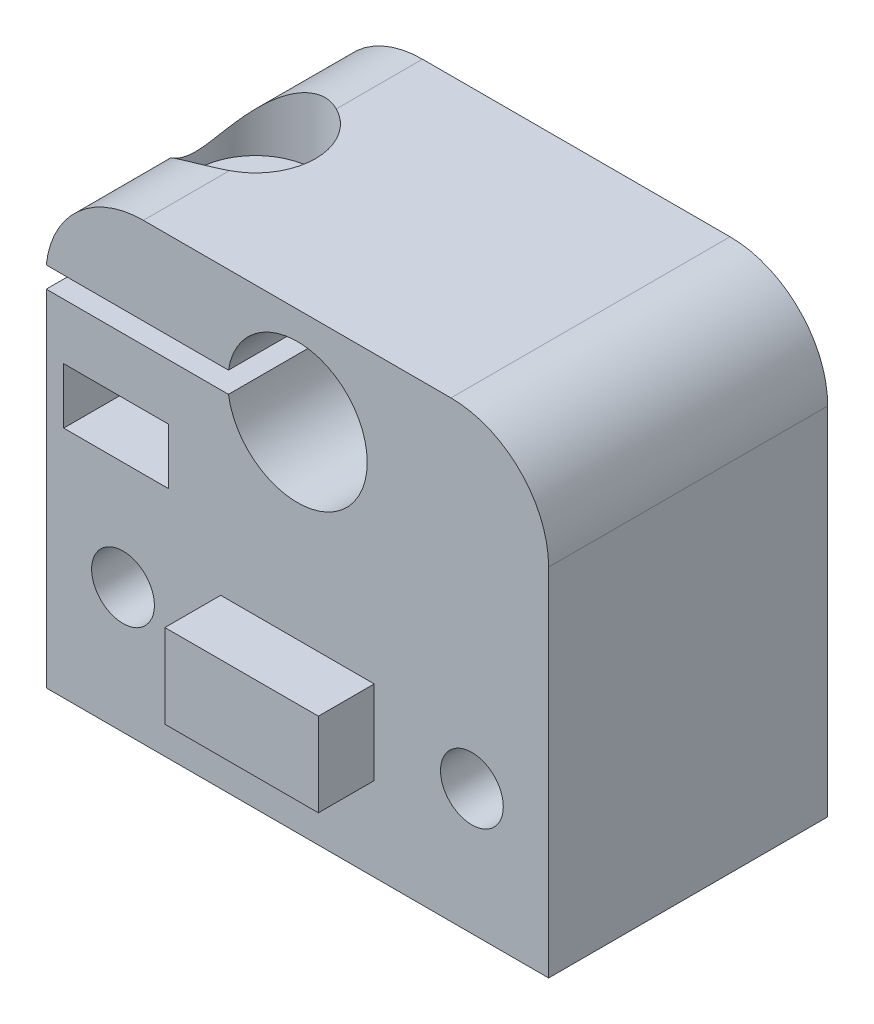
ISO-10303-21;
HEADER;
FILE_DESCRIPTION(('STEP AP214'),'2;1');
FILE_NAME('part.step','',(''),(''),'','','');
FILE_SCHEMA(('AUTOMOTIVE_DESIGN { 1 0 10303 214 1 1 1 1 }'));
ENDSEC;
DATA;
#1=APPLICATION_CONTEXT('core data for automotive mechanical design processes');
#2=APPLICATION_PROTOCOL_DEFINITION('international standard','automotive_design',2000,#1);
#3=PRODUCT_CONTEXT('',#1,'mechanical');
#4=PRODUCT('Part','Part','',(#3));
#5=PRODUCT_RELATED_PRODUCT_CATEGORY('part','',(#4));
#6=PRODUCT_DEFINITION_FORMATION('','',#4);
#7=PRODUCT_DEFINITION_CONTEXT('part definition',#1,'design');
#8=PRODUCT_DEFINITION('design','',#6,#7);
#9=PRODUCT_DEFINITION_SHAPE('','',#8);
#10=(LENGTH_UNIT() NAMED_UNIT(*) SI_UNIT(.MILLI.,.METRE.));
#11=(NAMED_UNIT(*) PLANE_ANGLE_UNIT() SI_UNIT($,.RADIAN.));
#12=(NAMED_UNIT(*) SI_UNIT($,.STERADIAN.) SOLID_ANGLE_UNIT());
#13=UNCERTAINTY_MEASURE_WITH_UNIT(LENGTH_MEASURE(1.E-05),#10,'distance_accuracy_value','');
#14=(GEOMETRIC_REPRESENTATION_CONTEXT(3) GLOBAL_UNCERTAINTY_ASSIGNED_CONTEXT((#13)) GLOBAL_UNIT_ASSIGNED_CONTEXT((#10,
#11,#12)) REPRESENTATION_CONTEXT('',''));
#15=CARTESIAN_POINT('',(0.,0.,0.));
#16=DIRECTION('',(0.,0.,1.));
#17=DIRECTION('',(1.,0.,0.));
#18=AXIS2_PLACEMENT_3D('',#15,#16,#17);
#19=CARTESIAN_POINT('',(5.5,9.,-27.));
#20=DIRECTION('',(0.,0.,1.));
#21=DIRECTION('',(1.,0.,0.));
#22=AXIS2_PLACEMENT_3D('',#19,#20,#21);
#23=CYLINDRICAL_SURFACE('',#22,2.25);
#24=CARTESIAN_POINT('',(5.5,9.,0.));
#25=DIRECTION('',(0.,0.,1.));
#26=DIRECTION('',(1.,0.,0.));
#27=AXIS2_PLACEMENT_3D('',#24,#25,#26);
#28=CIRCLE('',#27,2.25);
#29=CARTESIAN_POINT('',(7.75,9.,0.));
#30=VERTEX_POINT('',#29);
#31=EDGE_CURVE('E254',#30,#30,#28,.T.);
#32=ORIENTED_EDGE('',*,*,#31,.T.);
#33=EDGE_LOOP('',(#32));
#34=FACE_BOUND('',#33,.T.);
#35=CARTESIAN_POINT('',(5.5,9.,-13.));
#36=DIRECTION('',(0.,0.,-1.));
#37=DIRECTION('',(-1.,0.,0.));
#38=AXIS2_PLACEMENT_3D('',#35,#36,#37);
#39=CIRCLE('',#38,2.25);
#40=CARTESIAN_POINT('',(3.25,9.,-13.));
#41=VERTEX_POINT('',#40);
#42=EDGE_CURVE('E326',#41,#41,#39,.F.);
#43=ORIENTED_EDGE('',*,*,#42,.F.);
#44=EDGE_LOOP('',(#43));
#45=FACE_BOUND('',#44,.T.);
#46=ADVANCED_FACE('F33',(#34,#45),#23,.F.);
#47=CARTESIAN_POINT('',(30.5,9.,-27.));
#48=DIRECTION('',(0.,0.,1.));
#49=DIRECTION('',(1.,0.,0.));
#50=AXIS2_PLACEMENT_3D('',#47,#48,#49);
#51=CYLINDRICAL_SURFACE('',#50,2.25);
#52=CARTESIAN_POINT('',(30.5,9.,0.));
#53=DIRECTION('',(0.,0.,1.));
#54=DIRECTION('',(1.,0.,0.));
#55=AXIS2_PLACEMENT_3D('',#52,#53,#54);
#56=CIRCLE('',#55,2.25);
#57=CARTESIAN_POINT('',(32.75,9.,0.));
#58=VERTEX_POINT('',#57);
#59=EDGE_CURVE('E257',#58,#58,#56,.T.);
#60=ORIENTED_EDGE('',*,*,#59,.T.);
#61=EDGE_LOOP('',(#60));
#62=FACE_BOUND('',#61,.T.);
#63=CARTESIAN_POINT('',(30.5,9.,-13.));
#64=DIRECTION('',(0.,0.,-1.));
#65=DIRECTION('',(-1.,0.,0.));
#66=AXIS2_PLACEMENT_3D('',#63,#64,#65);
#67=CIRCLE('',#66,2.25);
#68=CARTESIAN_POINT('',(28.25,9.,-13.));
#69=VERTEX_POINT('',#68);
#70=EDGE_CURVE('E322',#69,#69,#67,.F.);
#71=ORIENTED_EDGE('',*,*,#70,.F.);
#72=EDGE_LOOP('',(#71));
#73=FACE_BOUND('',#72,.T.);
#74=ADVANCED_FACE('F368',(#62,#73),#51,.F.);
#75=CARTESIAN_POINT('',(5.,12.5,-10.));
#76=DIRECTION('',(0.,1.,0.));
#77=DIRECTION('',(0.,0.,1.));
#78=AXIS2_PLACEMENT_3D('',#75,#76,#77);
#79=CYLINDRICAL_SURFACE('',#78,2.25);
#80=CARTESIAN_POINT('',(5.,20.75,-10.));
#81=DIRECTION('',(0.,1.,0.));
#82=DIRECTION('',(0.,0.,1.));
#83=AXIS2_PLACEMENT_3D('',#80,#81,#82);
#84=CIRCLE('',#83,2.25);
#85=CARTESIAN_POINT('',(5.,20.75,-7.75));
#86=VERTEX_POINT('',#85);
#87=EDGE_CURVE('E199',#86,#86,#84,.F.);
#88=ORIENTED_EDGE('',*,*,#87,.T.);
#89=EDGE_LOOP('',(#88));
#90=FACE_BOUND('',#89,.T.);
#91=CARTESIAN_POINT('',(5.,24.75,-10.));
#92=DIRECTION('',(0.,-1.,0.));
#93=DIRECTION('',(1.,0.,0.));
#94=AXIS2_PLACEMENT_3D('',#91,#92,#93);
#95=CIRCLE('',#94,2.25);
#96=CARTESIAN_POINT('',(7.25,24.75,-10.));
#97=VERTEX_POINT('',#96);
#98=EDGE_CURVE('E218',#97,#97,#95,.T.);
#99=ORIENTED_EDGE('',*,*,#98,.F.);
#100=EDGE_LOOP('',(#99));
#101=FACE_BOUND('',#100,.T.);
#102=ADVANCED_FACE('F374',(#90,#101),#79,.F.);
#103=CARTESIAN_POINT('',(5.,26.25,-10.));
#104=DIRECTION('',(0.,1.,0.));
#105=DIRECTION('',(-1.,0.,0.));
#106=AXIS2_PLACEMENT_3D('',#103,#104,#105);
#107=CIRCLE('',#106,2.25);
#108=CARTESIAN_POINT('',(2.75,26.25,-10.));
#109=VERTEX_POINT('',#108);
#110=EDGE_CURVE('E217',#109,#109,#107,.T.);
#111=ORIENTED_EDGE('',*,*,#110,.F.);
#112=EDGE_LOOP('',(#111));
#113=FACE_BOUND('',#112,.T.);
#114=CARTESIAN_POINT('',(5.,27.5,-10.));
#115=DIRECTION('',(0.,1.,0.));
#116=DIRECTION('',(0.,0.,1.));
#117=AXIS2_PLACEMENT_3D('',#114,#115,#116);
#118=CIRCLE('',#117,2.25);
#119=CARTESIAN_POINT('',(5.,27.5,-7.75));
#120=VERTEX_POINT('',#119);
#121=EDGE_CURVE('E211',#120,#120,#118,.F.);
#122=ORIENTED_EDGE('',*,*,#121,.F.);
#123=EDGE_LOOP('',(#122));
#124=FACE_BOUND('',#123,.T.);
#125=ADVANCED_FACE('F408',(#113,#124),#79,.F.);
#126=CARTESIAN_POINT('',(0.,32.5,0.));
#127=DIRECTION('',(0.,0.,-1.));
#128=DIRECTION('',(-1.,0.,0.));
#129=AXIS2_PLACEMENT_3D('',#126,#127,#128);
#130=PLANE('',#129);
#131=DIRECTION('',(1.,0.,0.));
#132=VECTOR('',#131,1.);
#133=CARTESIAN_POINT('',(0.,20.75,0.));
#134=LINE('',#133,#132);
#135=CARTESIAN_POINT('',(1.25,20.75,0.));
#136=VERTEX_POINT('',#135);
#137=CARTESIAN_POINT('',(8.75,20.75,0.));
#138=VERTEX_POINT('',#137);
#139=EDGE_CURVE('E200',#136,#138,#134,.T.);
#140=ORIENTED_EDGE('',*,*,#139,.T.);
#141=DIRECTION('',(0.,-1.,0.));
#142=VECTOR('',#141,1.);
#143=CARTESIAN_POINT('',(8.75000000000001,32.5,0.));
#144=LINE('',#143,#142);
#145=CARTESIAN_POINT('',(8.75,16.75,0.));
#146=VERTEX_POINT('',#145);
#147=EDGE_CURVE('E204',#138,#146,#144,.T.);
#148=ORIENTED_EDGE('',*,*,#147,.T.);
#149=DIRECTION('',(-1.,0.,0.));
#150=VECTOR('',#149,1.);
#151=CARTESIAN_POINT('',(0.,16.75,0.));
#152=LINE('',#151,#150);
#153=CARTESIAN_POINT('',(1.25,16.75,0.));
#154=VERTEX_POINT('',#153);
#155=EDGE_CURVE('E197',#146,#154,#152,.T.);
#156=ORIENTED_EDGE('',*,*,#155,.T.);
#157=DIRECTION('',(0.,1.,0.));
#158=VECTOR('',#157,1.);
#159=CARTESIAN_POINT('',(1.25,32.5,0.));
#160=LINE('',#159,#158);
#161=EDGE_CURVE('E170',#154,#136,#160,.T.);
#162=ORIENTED_EDGE('',*,*,#161,.T.);
#163=EDGE_LOOP('',(#140,#148,#156,#162));
#164=FACE_BOUND('',#163,.T.);
#165=DIRECTION('',(0.,-1.,0.));
#166=VECTOR('',#165,1.);
#167=CARTESIAN_POINT('',(36.,32.5,0.));
#168=LINE('',#167,#166);
#169=CARTESIAN_POINT('',(36.,25.5,0.));
#170=VERTEX_POINT('',#169);
#171=CARTESIAN_POINT('',(36.,0.,0.));
#172=VERTEX_POINT('',#171);
#173=EDGE_CURVE('E300',#170,#172,#168,.T.);
#174=ORIENTED_EDGE('',*,*,#173,.F.);
#175=CARTESIAN_POINT('',(29.,25.5,0.));
#176=DIRECTION('',(0.,0.,-1.));
#177=DIRECTION('',(-1.,0.,0.));
#178=AXIS2_PLACEMENT_3D('',#175,#176,#177);
#179=CIRCLE('',#178,7.);
#180=CARTESIAN_POINT('',(29.,32.5,0.));
#181=VERTEX_POINT('',#180);
#182=EDGE_CURVE('E46',#170,#181,#179,.F.);
#183=ORIENTED_EDGE('',*,*,#182,.T.);
#184=DIRECTION('',(1.,0.,0.));
#185=VECTOR('',#184,1.);
#186=CARTESIAN_POINT('',(0.,32.5,0.));
#187=LINE('',#186,#185);
#188=CARTESIAN_POINT('',(6.95970545353753,32.5,0.));
#189=VERTEX_POINT('',#188);
#190=EDGE_CURVE('E279',#189,#181,#187,.T.);
#191=ORIENTED_EDGE('',*,*,#190,.F.);
#192=CARTESIAN_POINT('',(6.95970545353753,25.5,0.));
#193=DIRECTION('',(0.,0.,-1.));
#194=DIRECTION('',(-1.,0.,0.));
#195=AXIS2_PLACEMENT_3D('',#192,#193,#194);
#196=CIRCLE('',#195,7.);
#197=CARTESIAN_POINT('',(0.,26.25,0.));
#198=VERTEX_POINT('',#197);
#199=EDGE_CURVE('E342',#189,#198,#196,.F.);
#200=ORIENTED_EDGE('',*,*,#199,.T.);
#201=DIRECTION('',(-1.,0.,0.));
#202=VECTOR('',#201,1.);
#203=CARTESIAN_POINT('',(0.,26.25,0.));
#204=LINE('',#203,#202);
#205=CARTESIAN_POINT('',(13.0565700166787,26.25,0.));
#206=VERTEX_POINT('',#205);
#207=EDGE_CURVE('E263',#206,#198,#204,.T.);
#208=ORIENTED_EDGE('',*,*,#207,.F.);
#209=CARTESIAN_POINT('',(18.,25.5,0.));
#210=DIRECTION('',(0.,0.,1.));
#211=DIRECTION('',(1.,0.,0.));
#212=AXIS2_PLACEMENT_3D('',#209,#210,#211);
#213=CIRCLE('',#212,5.);
#214=CARTESIAN_POINT('',(13.0565700166787,24.75,0.));
#215=VERTEX_POINT('',#214);
#216=EDGE_CURVE('E260',#215,#206,#213,.T.);
#217=ORIENTED_EDGE('',*,*,#216,.F.);
#218=DIRECTION('',(1.,0.,0.));
#219=VECTOR('',#218,1.);
#220=CARTESIAN_POINT('',(0.,24.75,0.));
#221=LINE('',#220,#219);
#222=CARTESIAN_POINT('',(0.,24.75,0.));
#223=VERTEX_POINT('',#222);
#224=EDGE_CURVE('E266',#223,#215,#221,.T.);
#225=ORIENTED_EDGE('',*,*,#224,.F.);
#226=DIRECTION('',(0.,-1.,0.));
#227=VECTOR('',#226,1.);
#228=CARTESIAN_POINT('',(0.,32.5,0.));
#229=LINE('',#228,#227);
#230=CARTESIAN_POINT('',(0.,0.,0.));
#231=VERTEX_POINT('',#230);
#232=EDGE_CURVE('E302',#223,#231,#229,.T.);
#233=ORIENTED_EDGE('',*,*,#232,.T.);
#234=DIRECTION('',(1.,0.,0.));
#235=VECTOR('',#234,1.);
#236=CARTESIAN_POINT('',(0.,0.,0.));
#237=LINE('',#236,#235);
#238=EDGE_CURVE('E289',#231,#172,#237,.T.);
#239=ORIENTED_EDGE('',*,*,#238,.T.);
#240=EDGE_LOOP('',(#174,#183,#191,#200,#208,#217,#225,#233,#239));
#241=FACE_BOUND('',#240,.T.);
#242=ORIENTED_EDGE('',*,*,#59,.F.);
#243=EDGE_LOOP('',(#242));
#244=FACE_BOUND('',#243,.T.);
#245=ORIENTED_EDGE('',*,*,#31,.F.);
#246=EDGE_LOOP('',(#245));
#247=FACE_BOUND('',#246,.T.);
#248=DIRECTION('',(0.,1.,0.));
#249=VECTOR('',#248,1.);
#250=CARTESIAN_POINT('',(23.5,6.,0.));
#251=LINE('',#250,#249);
#252=CARTESIAN_POINT('',(23.5,6.,0.));
#253=VERTEX_POINT('',#252);
#254=CARTESIAN_POINT('',(23.5,12.,0.));
#255=VERTEX_POINT('',#254);
#256=EDGE_CURVE('E221',#253,#255,#251,.T.);
#257=ORIENTED_EDGE('',*,*,#256,.F.);
#258=DIRECTION('',(1.,0.,0.));
#259=VECTOR('',#258,1.);
#260=CARTESIAN_POINT('',(23.5,6.,0.));
#261=LINE('',#260,#259);
#262=CARTESIAN_POINT('',(12.5,5.99999999999999,0.));
#263=VERTEX_POINT('',#262);
#264=EDGE_CURVE('E226',#263,#253,#261,.T.);
#265=ORIENTED_EDGE('',*,*,#264,.F.);
#266=DIRECTION('',(0.,-1.,0.));
#267=VECTOR('',#266,1.);
#268=CARTESIAN_POINT('',(12.5,5.99999999999999,0.));
#269=LINE('',#268,#267);
#270=CARTESIAN_POINT('',(12.5,12.,0.));
#271=VERTEX_POINT('',#270);
#272=EDGE_CURVE('E238',#271,#263,#269,.T.);
#273=ORIENTED_EDGE('',*,*,#272,.F.);
#274=DIRECTION('',(-1.,0.,0.));
#275=VECTOR('',#274,1.);
#276=CARTESIAN_POINT('',(23.5,12.,0.));
#277=LINE('',#276,#275);
#278=EDGE_CURVE('E235',#255,#271,#277,.T.);
#279=ORIENTED_EDGE('',*,*,#278,.F.);
#280=EDGE_LOOP('',(#257,#265,#273,#279));
#281=FACE_BOUND('',#280,.T.);
#282=ADVANCED_FACE('F346',(#164,#241,#244,#247,#281),#130,.F.);
#283=CARTESIAN_POINT('',(0.,32.5,0.));
#284=DIRECTION('',(1.,0.,0.));
#285=DIRECTION('',(0.,0.,-1.));
#286=AXIS2_PLACEMENT_3D('',#283,#284,#285);
#287=PLANE('',#286);
#288=ORIENTED_EDGE('',*,*,#232,.F.);
#289=DIRECTION('',(0.,0.,1.));
#290=VECTOR('',#289,1.);
#291=CARTESIAN_POINT('',(0.,24.75,-47.));
#292=LINE('',#291,#290);
#293=CARTESIAN_POINT('',(0.,24.75,-20.));
#294=VERTEX_POINT('',#293);
#295=EDGE_CURVE('E273',#294,#223,#292,.T.);
#296=ORIENTED_EDGE('',*,*,#295,.F.);
#297=DIRECTION('',(0.,-1.,0.));
#298=VECTOR('',#297,1.);
#299=CARTESIAN_POINT('',(0.,32.5,-20.));
#300=LINE('',#299,#298);
#301=CARTESIAN_POINT('',(0.,0.,-20.));
#302=VERTEX_POINT('',#301);
#303=EDGE_CURVE('E286',#294,#302,#300,.T.);
#304=ORIENTED_EDGE('',*,*,#303,.T.);
#305=DIRECTION('',(0.,0.,1.));
#306=VECTOR('',#305,1.);
#307=CARTESIAN_POINT('',(0.,0.,0.));
#308=LINE('',#307,#306);
#309=EDGE_CURVE('E272',#302,#231,#308,.T.);
#310=ORIENTED_EDGE('',*,*,#309,.T.);
#311=EDGE_LOOP('',(#288,#296,#304,#310));
#312=FACE_BOUND('',#311,.T.);
#313=ADVANCED_FACE('F406',(#312),#287,.F.);
#314=CARTESIAN_POINT('',(36.,32.5,0.));
#315=DIRECTION('',(-1.,0.,0.));
#316=DIRECTION('',(0.,0.,1.));
#317=AXIS2_PLACEMENT_3D('',#314,#315,#316);
#318=PLANE('',#317);
#319=DIRECTION('',(0.,-1.,0.));
#320=VECTOR('',#319,1.);
#321=CARTESIAN_POINT('',(36.,32.5,-20.));
#322=LINE('',#321,#320);
#323=CARTESIAN_POINT('',(36.,25.5,-20.));
#324=VERTEX_POINT('',#323);
#325=CARTESIAN_POINT('',(36.,0.,-20.));
#326=VERTEX_POINT('',#325);
#327=EDGE_CURVE('E298',#324,#326,#322,.T.);
#328=ORIENTED_EDGE('',*,*,#327,.F.);
#329=DIRECTION('',(0.,0.,-1.));
#330=VECTOR('',#329,1.);
#331=CARTESIAN_POINT('',(36.,25.5,0.));
#332=LINE('',#331,#330);
#333=EDGE_CURVE('E53',#324,#170,#332,.F.);
#334=ORIENTED_EDGE('',*,*,#333,.T.);
#335=ORIENTED_EDGE('',*,*,#173,.T.);
#336=DIRECTION('',(0.,0.,-1.));
#337=VECTOR('',#336,1.);
#338=CARTESIAN_POINT('',(36.,0.,0.));
#339=LINE('',#338,#337);
#340=EDGE_CURVE('E292',#172,#326,#339,.T.);
#341=ORIENTED_EDGE('',*,*,#340,.T.);
#342=EDGE_LOOP('',(#328,#334,#335,#341));
#343=FACE_BOUND('',#342,.T.);
#344=ADVANCED_FACE('F402',(#343),#318,.F.);
#345=CARTESIAN_POINT('',(0.,32.5,-20.));
#346=DIRECTION('',(0.,0.,1.));
#347=DIRECTION('',(1.,0.,0.));
#348=AXIS2_PLACEMENT_3D('',#345,#346,#347);
#349=PLANE('',#348);
#350=CARTESIAN_POINT('',(5.5,9.,-20.));
#351=DIRECTION('',(0.,0.,-1.));
#352=DIRECTION('',(-1.,0.,0.));
#353=AXIS2_PLACEMENT_3D('',#350,#351,#352);
#354=CIRCLE('',#353,4.3);
#355=CARTESIAN_POINT('',(1.2,9.,-20.));
#356=VERTEX_POINT('',#355);
#357=EDGE_CURVE('E682',#356,#356,#354,.T.);
#358=ORIENTED_EDGE('',*,*,#357,.F.);
#359=EDGE_LOOP('',(#358));
#360=FACE_BOUND('',#359,.T.);
#361=CARTESIAN_POINT('',(30.5,9.,-20.));
#362=DIRECTION('',(0.,0.,-1.));
#363=DIRECTION('',(-1.,0.,0.));
#364=AXIS2_PLACEMENT_3D('',#361,#362,#363);
#365=CIRCLE('',#364,4.3);
#366=CARTESIAN_POINT('',(26.2,9.,-20.));
#367=VERTEX_POINT('',#366);
#368=EDGE_CURVE('E329',#367,#367,#365,.T.);
#369=ORIENTED_EDGE('',*,*,#368,.F.);
#370=EDGE_LOOP('',(#369));
#371=FACE_BOUND('',#370,.T.);
#372=DIRECTION('',(-1.,0.,0.));
#373=VECTOR('',#372,1.);
#374=CARTESIAN_POINT('',(8.75,16.75,-20.));
#375=LINE('',#374,#373);
#376=CARTESIAN_POINT('',(8.75,16.75,-20.));
#377=VERTEX_POINT('',#376);
#378=CARTESIAN_POINT('',(1.25,16.75,-20.));
#379=VERTEX_POINT('',#378);
#380=EDGE_CURVE('E178',#377,#379,#375,.T.);
#381=ORIENTED_EDGE('',*,*,#380,.F.);
#382=DIRECTION('',(0.,-1.,0.));
#383=VECTOR('',#382,1.);
#384=CARTESIAN_POINT('',(8.75,20.75,-20.));
#385=LINE('',#384,#383);
#386=CARTESIAN_POINT('',(8.75,20.75,-20.));
#387=VERTEX_POINT('',#386);
#388=EDGE_CURVE('E183',#387,#377,#385,.T.);
#389=ORIENTED_EDGE('',*,*,#388,.F.);
#390=DIRECTION('',(1.,0.,0.));
#391=VECTOR('',#390,1.);
#392=CARTESIAN_POINT('',(8.75,20.75,-20.));
#393=LINE('',#392,#391);
#394=CARTESIAN_POINT('',(1.25,20.75,-20.));
#395=VERTEX_POINT('',#394);
#396=EDGE_CURVE('E187',#395,#387,#393,.T.);
#397=ORIENTED_EDGE('',*,*,#396,.F.);
#398=DIRECTION('',(0.,1.,0.));
#399=VECTOR('',#398,1.);
#400=CARTESIAN_POINT('',(1.25,20.75,-20.));
#401=LINE('',#400,#399);
#402=EDGE_CURVE('E167',#379,#395,#401,.T.);
#403=ORIENTED_EDGE('',*,*,#402,.F.);
#404=EDGE_LOOP('',(#381,#389,#397,#403));
#405=FACE_BOUND('',#404,.T.);
#406=DIRECTION('',(-1.,0.,0.));
#407=VECTOR('',#406,1.);
#408=CARTESIAN_POINT('',(0.,32.5,-20.));
#409=LINE('',#408,#407);
#410=CARTESIAN_POINT('',(29.,32.5,-20.));
#411=VERTEX_POINT('',#410);
#412=CARTESIAN_POINT('',(6.95970545353753,32.5,-20.));
#413=VERTEX_POINT('',#412);
#414=EDGE_CURVE('E282',#411,#413,#409,.T.);
#415=ORIENTED_EDGE('',*,*,#414,.F.);
#416=CARTESIAN_POINT('',(29.,25.5,-20.));
#417=DIRECTION('',(0.,0.,1.));
#418=DIRECTION('',(1.,0.,0.));
#419=AXIS2_PLACEMENT_3D('',#416,#417,#418);
#420=CIRCLE('',#419,7.);
#421=EDGE_CURVE('E61',#411,#324,#420,.F.);
#422=ORIENTED_EDGE('',*,*,#421,.T.);
#423=ORIENTED_EDGE('',*,*,#327,.T.);
#424=DIRECTION('',(-1.,0.,0.));
#425=VECTOR('',#424,1.);
#426=CARTESIAN_POINT('',(0.,0.,-20.));
#427=LINE('',#426,#425);
#428=EDGE_CURVE('E283',#326,#302,#427,.T.);
#429=ORIENTED_EDGE('',*,*,#428,.T.);
#430=ORIENTED_EDGE('',*,*,#303,.F.);
#431=DIRECTION('',(1.,0.,0.));
#432=VECTOR('',#431,1.);
#433=CARTESIAN_POINT('',(0.,24.75,-20.));
#434=LINE('',#433,#432);
#435=CARTESIAN_POINT('',(13.0565700166787,24.75,-20.));
#436=VERTEX_POINT('',#435);
#437=EDGE_CURVE('E310',#294,#436,#434,.T.);
#438=ORIENTED_EDGE('',*,*,#437,.T.);
#439=CARTESIAN_POINT('',(18.,25.5,-20.));
#440=DIRECTION('',(0.,0.,1.));
#441=DIRECTION('',(1.,0.,0.));
#442=AXIS2_PLACEMENT_3D('',#439,#440,#441);
#443=CIRCLE('',#442,5.);
#444=CARTESIAN_POINT('',(13.0565700166787,26.25,-20.));
#445=VERTEX_POINT('',#444);
#446=EDGE_CURVE('E307',#436,#445,#443,.T.);
#447=ORIENTED_EDGE('',*,*,#446,.T.);
#448=DIRECTION('',(-1.,0.,0.));
#449=VECTOR('',#448,1.);
#450=CARTESIAN_POINT('',(0.,26.25,-20.));
#451=LINE('',#450,#449);
#452=CARTESIAN_POINT('',(0.,26.25,-20.));
#453=VERTEX_POINT('',#452);
#454=EDGE_CURVE('E304',#445,#453,#451,.T.);
#455=ORIENTED_EDGE('',*,*,#454,.T.);
#456=CARTESIAN_POINT('',(6.95970545353753,25.5,-20.));
#457=DIRECTION('',(0.,0.,1.));
#458=DIRECTION('',(1.,0.,0.));
#459=AXIS2_PLACEMENT_3D('',#456,#457,#458);
#460=CIRCLE('',#459,7.);
#461=EDGE_CURVE('E338',#453,#413,#460,.F.);
#462=ORIENTED_EDGE('',*,*,#461,.T.);
#463=EDGE_LOOP('',(#415,#422,#423,#429,#430,#438,#447,#455,#462));
#464=FACE_BOUND('',#463,.T.);
#465=ADVANCED_FACE('F185',(#360,#371,#405,#464),#349,.F.);
#466=CARTESIAN_POINT('',(0.,32.5,0.));
#467=DIRECTION('',(0.,-1.,0.));
#468=DIRECTION('',(0.,0.,-1.));
#469=AXIS2_PLACEMENT_3D('',#466,#467,#468);
#470=PLANE('',#469);
#471=ORIENTED_EDGE('',*,*,#190,.T.);
#472=DIRECTION('',(0.,0.,-1.));
#473=VECTOR('',#472,1.);
#474=CARTESIAN_POINT('',(29.,32.5,0.));
#475=LINE('',#474,#473);
#476=EDGE_CURVE('E335',#181,#411,#475,.T.);
#477=ORIENTED_EDGE('',*,*,#476,.T.);
#478=ORIENTED_EDGE('',*,*,#414,.T.);
#479=DIRECTION('',(0.,0.,1.));
#480=VECTOR('',#479,1.);
#481=CARTESIAN_POINT('',(6.95970545353753,32.5,0.));
#482=LINE('',#481,#480);
#483=CARTESIAN_POINT('',(6.95970545353753,32.5,-13.8274736492072));
#484=VERTEX_POINT('',#483);
#485=EDGE_CURVE('E332',#413,#484,#482,.T.);
#486=ORIENTED_EDGE('',*,*,#485,.T.);
#487=CARTESIAN_POINT('',(5.,32.5,-10.));
#488=DIRECTION('',(0.,1.,0.));
#489=DIRECTION('',(0.,0.,1.));
#490=AXIS2_PLACEMENT_3D('',#487,#488,#489);
#491=CIRCLE('',#490,4.3);
#492=CARTESIAN_POINT('',(6.95970545353753,32.5,-6.17252635079283));
#493=VERTEX_POINT('',#492);
#494=EDGE_CURVE('E207',#493,#484,#491,.T.);
#495=ORIENTED_EDGE('',*,*,#494,.F.);
#496=DIRECTION('',(0.,0.,1.));
#497=VECTOR('',#496,1.);
#498=CARTESIAN_POINT('',(6.95970545353753,32.5,0.));
#499=LINE('',#498,#497);
#500=EDGE_CURVE('E313',#493,#189,#499,.T.);
#501=ORIENTED_EDGE('',*,*,#500,.T.);
#502=EDGE_LOOP('',(#471,#477,#478,#486,#495,#501));
#503=FACE_BOUND('',#502,.T.);
#504=ADVANCED_FACE('F352',(#503),#470,.F.);
#505=CARTESIAN_POINT('',(0.,0.,0.));
#506=DIRECTION('',(0.,-1.,0.));
#507=DIRECTION('',(0.,0.,-1.));
#508=AXIS2_PLACEMENT_3D('',#505,#506,#507);
#509=PLANE('',#508);
#510=ORIENTED_EDGE('',*,*,#309,.F.);
#511=ORIENTED_EDGE('',*,*,#428,.F.);
#512=ORIENTED_EDGE('',*,*,#340,.F.);
#513=ORIENTED_EDGE('',*,*,#238,.F.);
#514=EDGE_LOOP('',(#510,#511,#512,#513));
#515=FACE_BOUND('',#514,.T.);
#516=ADVANCED_FACE('F393',(#515),#509,.T.);
#517=CARTESIAN_POINT('',(18.,25.5,-47.));
#518=DIRECTION('',(0.,0.,1.));
#519=DIRECTION('',(1.,0.,0.));
#520=AXIS2_PLACEMENT_3D('',#517,#518,#519);
#521=CYLINDRICAL_SURFACE('',#520,5.);
#522=DIRECTION('',(0.,0.,1.));
#523=VECTOR('',#522,1.);
#524=CARTESIAN_POINT('',(13.0565700166787,24.75,-47.));
#525=LINE('',#524,#523);
#526=EDGE_CURVE('E270',#436,#215,#525,.T.);
#527=ORIENTED_EDGE('',*,*,#526,.T.);
#528=ORIENTED_EDGE('',*,*,#216,.T.);
#529=DIRECTION('',(0.,0.,1.));
#530=VECTOR('',#529,1.);
#531=CARTESIAN_POINT('',(13.0565700166787,26.25,-47.));
#532=LINE('',#531,#530);
#533=EDGE_CURVE('E269',#445,#206,#532,.T.);
#534=ORIENTED_EDGE('',*,*,#533,.F.);
#535=ORIENTED_EDGE('',*,*,#446,.F.);
#536=EDGE_LOOP('',(#527,#528,#534,#535));
#537=FACE_BOUND('',#536,.T.);
#538=ADVANCED_FACE('F386',(#537),#521,.F.);
#539=CARTESIAN_POINT('',(0.,24.75,-47.));
#540=DIRECTION('',(0.,-1.,0.));
#541=DIRECTION('',(1.,0.,0.));
#542=AXIS2_PLACEMENT_3D('',#539,#540,#541);
#543=PLANE('',#542);
#544=ORIENTED_EDGE('',*,*,#98,.T.);
#545=EDGE_LOOP('',(#544));
#546=FACE_BOUND('',#545,.T.);
#547=ORIENTED_EDGE('',*,*,#295,.T.);
#548=ORIENTED_EDGE('',*,*,#224,.T.);
#549=ORIENTED_EDGE('',*,*,#526,.F.);
#550=ORIENTED_EDGE('',*,*,#437,.F.);
#551=EDGE_LOOP('',(#547,#548,#549,#550));
#552=FACE_BOUND('',#551,.T.);
#553=ADVANCED_FACE('F382',(#546,#552),#543,.F.);
#554=CARTESIAN_POINT('',(0.,26.25,-47.));
#555=DIRECTION('',(0.,1.,0.));
#556=DIRECTION('',(-1.,0.,0.));
#557=AXIS2_PLACEMENT_3D('',#554,#555,#556);
#558=PLANE('',#557);
#559=ORIENTED_EDGE('',*,*,#110,.T.);
#560=EDGE_LOOP('',(#559));
#561=FACE_BOUND('',#560,.T.);
#562=ORIENTED_EDGE('',*,*,#533,.T.);
#563=ORIENTED_EDGE('',*,*,#207,.T.);
#564=DIRECTION('',(0.,0.,1.));
#565=VECTOR('',#564,1.);
#566=CARTESIAN_POINT('',(0.,26.25,-47.));
#567=LINE('',#566,#565);
#568=EDGE_CURVE('E275',#453,#198,#567,.T.);
#569=ORIENTED_EDGE('',*,*,#568,.F.);
#570=ORIENTED_EDGE('',*,*,#454,.F.);
#571=EDGE_LOOP('',(#562,#563,#569,#570));
#572=FACE_BOUND('',#571,.T.);
#573=ADVANCED_FACE('F385',(#561,#572),#558,.F.);
#574=CARTESIAN_POINT('',(23.5,6.,4.));
#575=DIRECTION('',(-1.,0.,0.));
#576=DIRECTION('',(0.,0.,1.));
#577=AXIS2_PLACEMENT_3D('',#574,#575,#576);
#578=PLANE('',#577);
#579=ORIENTED_EDGE('',*,*,#256,.T.);
#580=DIRECTION('',(0.,0.,-1.));
#581=VECTOR('',#580,1.);
#582=CARTESIAN_POINT('',(23.5,12.,4.));
#583=LINE('',#582,#581);
#584=CARTESIAN_POINT('',(23.5,12.,4.));
#585=VERTEX_POINT('',#584);
#586=EDGE_CURVE('E251',#585,#255,#583,.T.);
#587=ORIENTED_EDGE('',*,*,#586,.F.);
#588=DIRECTION('',(0.,1.,0.));
#589=VECTOR('',#588,1.);
#590=CARTESIAN_POINT('',(23.5,6.,4.));
#591=LINE('',#590,#589);
#592=CARTESIAN_POINT('',(23.5,6.,4.));
#593=VERTEX_POINT('',#592);
#594=EDGE_CURVE('E222',#593,#585,#591,.T.);
#595=ORIENTED_EDGE('',*,*,#594,.F.);
#596=DIRECTION('',(0.,0.,-1.));
#597=VECTOR('',#596,1.);
#598=CARTESIAN_POINT('',(23.5,6.,4.));
#599=LINE('',#598,#597);
#600=EDGE_CURVE('E232',#593,#253,#599,.T.);
#601=ORIENTED_EDGE('',*,*,#600,.T.);
#602=EDGE_LOOP('',(#579,#587,#595,#601));
#603=FACE_BOUND('',#602,.T.);
#604=ADVANCED_FACE('F379',(#603),#578,.F.);
#605=CARTESIAN_POINT('',(23.5,12.,4.));
#606=DIRECTION('',(0.,-1.,0.));
#607=DIRECTION('',(0.,0.,-1.));
#608=AXIS2_PLACEMENT_3D('',#605,#606,#607);
#609=PLANE('',#608);
#610=ORIENTED_EDGE('',*,*,#278,.T.);
#611=DIRECTION('',(0.,0.,-1.));
#612=VECTOR('',#611,1.);
#613=CARTESIAN_POINT('',(12.5,12.,4.));
#614=LINE('',#613,#612);
#615=CARTESIAN_POINT('',(12.5,12.,4.));
#616=VERTEX_POINT('',#615);
#617=EDGE_CURVE('E248',#616,#271,#614,.T.);
#618=ORIENTED_EDGE('',*,*,#617,.F.);
#619=DIRECTION('',(-1.,0.,0.));
#620=VECTOR('',#619,1.);
#621=CARTESIAN_POINT('',(23.5,12.,4.));
#622=LINE('',#621,#620);
#623=EDGE_CURVE('E225',#585,#616,#622,.T.);
#624=ORIENTED_EDGE('',*,*,#623,.F.);
#625=ORIENTED_EDGE('',*,*,#586,.T.);
#626=EDGE_LOOP('',(#610,#618,#624,#625));
#627=FACE_BOUND('',#626,.T.);
#628=ADVANCED_FACE('F468',(#627),#609,.F.);
#629=CARTESIAN_POINT('',(12.5,5.99999999999999,4.));
#630=DIRECTION('',(1.,0.,0.));
#631=DIRECTION('',(0.,1.,0.));
#632=AXIS2_PLACEMENT_3D('',#629,#630,#631);
#633=PLANE('',#632);
#634=ORIENTED_EDGE('',*,*,#272,.T.);
#635=DIRECTION('',(0.,0.,-1.));
#636=VECTOR('',#635,1.);
#637=CARTESIAN_POINT('',(12.5,5.99999999999999,4.));
#638=LINE('',#637,#636);
#639=CARTESIAN_POINT('',(12.5,5.99999999999999,4.));
#640=VERTEX_POINT('',#639);
#641=EDGE_CURVE('E245',#640,#263,#638,.T.);
#642=ORIENTED_EDGE('',*,*,#641,.F.);
#643=DIRECTION('',(0.,-1.,0.));
#644=VECTOR('',#643,1.);
#645=CARTESIAN_POINT('',(12.5,5.99999999999999,4.));
#646=LINE('',#645,#644);
#647=EDGE_CURVE('E228',#616,#640,#646,.T.);
#648=ORIENTED_EDGE('',*,*,#647,.F.);
#649=ORIENTED_EDGE('',*,*,#617,.T.);
#650=EDGE_LOOP('',(#634,#642,#648,#649));
#651=FACE_BOUND('',#650,.T.);
#652=ADVANCED_FACE('F465',(#651),#633,.F.);
#653=CARTESIAN_POINT('',(23.5,6.,4.));
#654=DIRECTION('',(0.,1.,0.));
#655=DIRECTION('',(-1.,0.,0.));
#656=AXIS2_PLACEMENT_3D('',#653,#654,#655);
#657=PLANE('',#656);
#658=ORIENTED_EDGE('',*,*,#264,.T.);
#659=ORIENTED_EDGE('',*,*,#600,.F.);
#660=DIRECTION('',(1.,0.,0.));
#661=VECTOR('',#660,1.);
#662=CARTESIAN_POINT('',(23.5,6.,4.));
#663=LINE('',#662,#661);
#664=EDGE_CURVE('E230',#640,#593,#663,.T.);
#665=ORIENTED_EDGE('',*,*,#664,.F.);
#666=ORIENTED_EDGE('',*,*,#641,.T.);
#667=EDGE_LOOP('',(#658,#659,#665,#666));
#668=FACE_BOUND('',#667,.T.);
#669=ADVANCED_FACE('F461',(#668),#657,.F.);
#670=CARTESIAN_POINT('',(0.,0.,4.));
#671=DIRECTION('',(0.,0.,1.));
#672=DIRECTION('',(1.,0.,0.));
#673=AXIS2_PLACEMENT_3D('',#670,#671,#672);
#674=PLANE('',#673);
#675=ORIENTED_EDGE('',*,*,#594,.T.);
#676=ORIENTED_EDGE('',*,*,#623,.T.);
#677=ORIENTED_EDGE('',*,*,#647,.T.);
#678=ORIENTED_EDGE('',*,*,#664,.T.);
#679=EDGE_LOOP('',(#675,#676,#677,#678));
#680=FACE_BOUND('',#679,.T.);
#681=ADVANCED_FACE('F444',(#680),#674,.T.);
#682=CARTESIAN_POINT('',(5.,27.5,-10.));
#683=DIRECTION('',(0.,1.,0.));
#684=DIRECTION('',(0.,0.,1.));
#685=AXIS2_PLACEMENT_3D('',#682,#683,#684);
#686=PLANE('',#685);
#687=CARTESIAN_POINT('',(5.,27.5,-10.));
#688=DIRECTION('',(0.,1.,0.));
#689=DIRECTION('',(0.,0.,1.));
#690=AXIS2_PLACEMENT_3D('',#687,#688,#689);
#691=CIRCLE('',#690,4.3);
#692=CARTESIAN_POINT('',(5.,27.5,-5.7));
#693=VERTEX_POINT('',#692);
#694=EDGE_CURVE('E208',#693,#693,#691,.T.);
#695=ORIENTED_EDGE('',*,*,#694,.T.);
#696=EDGE_LOOP('',(#695));
#697=FACE_BOUND('',#696,.T.);
#698=ORIENTED_EDGE('',*,*,#121,.T.);
#699=EDGE_LOOP('',(#698));
#700=FACE_BOUND('',#699,.T.);
#701=ADVANCED_FACE('F436',(#697,#700),#686,.T.);
#702=CARTESIAN_POINT('',(5.,27.5,-10.));
#703=DIRECTION('',(0.,1.,0.));
#704=DIRECTION('',(0.,0.,1.));
#705=AXIS2_PLACEMENT_3D('',#702,#703,#704);
#706=CYLINDRICAL_SURFACE('',#705,4.3);
#707=ORIENTED_EDGE('',*,*,#694,.F.);
#708=EDGE_LOOP('',(#707));
#709=FACE_BOUND('',#708,.T.);
#710=ORIENTED_EDGE('',*,*,#494,.T.);
#711=CARTESIAN_POINT('',(6.95970545353753,32.5,-13.8274736492072));
#712=CARTESIAN_POINT('',(6.86485980299332,32.5000157594265,-13.8760558488262));
#713=CARTESIAN_POINT('',(6.76818233171087,32.49807296373,-13.9210858075222));
#714=CARTESIAN_POINT('',(6.57190018526185,32.4899354226407,-14.0038021268559));
#715=CARTESIAN_POINT('',(6.47229524474797,32.4837402906693,-14.0414878194285));
#716=CARTESIAN_POINT('',(6.27121242645337,32.4667884301011,-14.1091664915717));
#717=CARTESIAN_POINT('',(6.16974102068272,32.456045361496,-14.1391820793067));
#718=CARTESIAN_POINT('',(5.96545358462876,32.4297953473019,-14.1915408183869));
#719=CARTESIAN_POINT('',(5.86263767199692,32.4142888159055,-14.2138846364503));
#720=CARTESIAN_POINT('',(5.65636781139271,32.3783923525192,-14.2509025643201));
#721=CARTESIAN_POINT('',(5.55291331656792,32.3579974212563,-14.265568773172));
#722=CARTESIAN_POINT('',(5.34624445114366,32.3123380163797,-14.2872971390143));
#723=CARTESIAN_POINT('',(5.2430301869575,32.2870716918246,-14.2943563989183));
#724=CARTESIAN_POINT('',(5.03768284078307,32.2317994796074,-14.3010609964416));
#725=CARTESIAN_POINT('',(4.93554931980669,32.2017956018574,-14.3007094697519));
#726=CARTESIAN_POINT('',(4.73298889515788,32.1372478936225,-14.2929005456456));
#727=CARTESIAN_POINT('',(4.63256265429899,32.1027023434252,-14.2854404498375));
#728=CARTESIAN_POINT('',(4.33201883389298,31.9916225861249,-14.2526131622034));
#729=CARTESIAN_POINT('',(4.13541326205748,31.9083947603514,-14.2167244284685));
#730=CARTESIAN_POINT('',(3.75547424188088,31.7271466127745,-14.1206399421258));
#731=CARTESIAN_POINT('',(3.57215119003496,31.6291148848614,-14.0604253865071));
#732=CARTESIAN_POINT('',(3.27045028521884,31.4507050573421,-13.939179319041));
#733=CARTESIAN_POINT('',(3.14832942429919,31.3731376116062,-13.8831603159493));
#734=CARTESIAN_POINT('',(2.91231535188813,31.213052223584,-13.7615424528108));
#735=CARTESIAN_POINT('',(2.7984252331166,31.1305324415457,-13.6959400194562));
#736=CARTESIAN_POINT('',(2.57890224979119,30.9614831947322,-13.556018259791));
#737=CARTESIAN_POINT('',(2.47328589130005,30.8749462370013,-13.481682212853));
#738=CARTESIAN_POINT('',(2.27059771117065,30.6990642927737,-13.325170247404));
#739=CARTESIAN_POINT('',(2.17352486364312,30.6097196451725,-13.2429952726535));
#740=CARTESIAN_POINT('',(1.98619932017287,30.4276366028303,-13.0697841248151));
#741=CARTESIAN_POINT('',(1.89610125946766,30.3348660612213,-12.9786148342036));
#742=CARTESIAN_POINT('',(1.72464174702172,30.1486691168309,-12.7889739352085));
#743=CARTESIAN_POINT('',(1.64328215579714,30.0552425788739,-12.690500779267));
#744=CARTESIAN_POINT('',(1.48945070170155,29.8693065259135,-12.4864328712023));
#745=CARTESIAN_POINT('',(1.41696372874963,29.7767957056079,-12.3808507149231));
#746=CARTESIAN_POINT('',(1.28086816601703,29.5943550233917,-12.1620933735568));
#747=CARTESIAN_POINT('',(1.21725503974909,29.5044238615263,-12.0489221123131));
#748=CARTESIAN_POINT('',(1.09598607640001,29.3248068587181,-11.8077334100817));
#749=CARTESIAN_POINT('',(1.03884529574351,29.2354026265662,-11.67924272089));
#750=CARTESIAN_POINT('',(0.935704145501806,29.0666713656923,-11.4114114709015));
#751=CARTESIAN_POINT('',(0.88970003472595,28.987340957096,-11.2720745745646));
#752=CARTESIAN_POINT('',(0.817977595019825,28.8591018855981,-11.0078737091935));
#753=CARTESIAN_POINT('',(0.790085083180846,28.8072817602549,-10.8850544430677));
#754=CARTESIAN_POINT('',(0.74470882393575,28.7212143553881,-10.6316150707679));
#755=CARTESIAN_POINT('',(0.727196275981726,28.6869184894093,-10.501017666116));
#756=CARTESIAN_POINT('',(0.706351229385995,28.6457924809204,-10.25822683694));
#757=CARTESIAN_POINT('',(0.70105916699366,28.6351785374071,-10.1468616336709));
#758=CARTESIAN_POINT('',(0.699230888404852,28.6315281812828,-9.92377034429629));
#759=CARTESIAN_POINT('',(0.702692579024775,28.6384875665645,-9.81204435084275));
#760=CARTESIAN_POINT('',(0.717975151088147,28.6687637561382,-9.59208841617446));
#761=CARTESIAN_POINT('',(0.7297556503233,28.6920015354676,-9.4838442166289));
#762=CARTESIAN_POINT('',(0.760693700317559,28.7516709138546,-9.2721510281226));
#763=CARTESIAN_POINT('',(0.779860601713978,28.7881192329823,-9.16870830420647));
#764=CARTESIAN_POINT('',(0.822673276695017,28.8672963380855,-8.97585740220991));
#765=CARTESIAN_POINT('',(0.845805669832361,28.909237302262,-8.88600105110106));
#766=CARTESIAN_POINT('',(0.896818453754331,28.9991535119019,-8.71072126112922));
#767=CARTESIAN_POINT('',(0.924702661834952,29.047133600637,-8.62530145885162));
#768=CARTESIAN_POINT('',(0.984874802486657,29.1475797862725,-8.45835437463777));
#769=CARTESIAN_POINT('',(1.01717765833098,29.200060850295,-8.37684160495063));
#770=CARTESIAN_POINT('',(1.08583157161244,29.3081114584943,-8.21764275449327));
#771=CARTESIAN_POINT('',(1.12218405671378,29.3636820883921,-8.13995803728196));
#772=CARTESIAN_POINT('',(1.226790005701,29.5184156099661,-7.93248443825901));
#773=CARTESIAN_POINT('',(1.29890745218261,29.6196960198293,-7.80620665468936));
#774=CARTESIAN_POINT('',(1.45425526321959,29.8251190394823,-7.56309692331075));
#775=CARTESIAN_POINT('',(1.53749299635888,29.9292635104176,-7.4462713218887));
#776=CARTESIAN_POINT('',(1.71490428666682,30.1379753385805,-7.22176303842054));
#777=CARTESIAN_POINT('',(1.80907341262212,30.2425425079846,-7.114076682069));
#778=CARTESIAN_POINT('',(2.00837460269378,30.45025614537,-6.90795953708269));
#779=CARTESIAN_POINT('',(2.11350238581564,30.5534031504433,-6.8095251625307));
#780=CARTESIAN_POINT('',(2.31798559858409,30.7412477752236,-6.63668501536667));
#781=CARTESIAN_POINT('',(2.41579031192234,30.8263669668061,-6.56090095240159));
#782=CARTESIAN_POINT('',(2.61939085466697,30.9935434726535,-6.41695023462518));
#783=CARTESIAN_POINT('',(2.72518873781904,31.075599991856,-6.34878554874964));
#784=CARTESIAN_POINT('',(2.94447529923706,31.2355306627642,-6.22099302003464));
#785=CARTESIAN_POINT('',(3.05795021935716,31.3134118703536,-6.16135047195579));
#786=CARTESIAN_POINT('',(3.29254760483369,31.464175095705,-6.051407791136));
#787=CARTESIAN_POINT('',(3.41367031634125,31.5370569524006,-6.0011079593045));
#788=CARTESIAN_POINT('',(3.63703411061405,31.6621954089585,-5.92037601402919));
#789=CARTESIAN_POINT('',(3.73793866118142,31.7155816025317,-5.88798840673623));
#790=CARTESIAN_POINT('',(3.94387008894899,31.8180658847195,-5.83034573842297));
#791=CARTESIAN_POINT('',(4.04889606425242,31.8671649040011,-5.8050891267221));
#792=CARTESIAN_POINT('',(4.26257072541122,31.9605770166892,-5.76230418260198));
#793=CARTESIAN_POINT('',(4.37121856573825,32.0048912170179,-5.74477405982859));
#794=CARTESIAN_POINT('',(4.59147056334376,32.0882714727267,-5.71801409078185));
#795=CARTESIAN_POINT('',(4.70307347438793,32.1273396995683,-5.70878080114262));
#796=CARTESIAN_POINT('',(4.92930459578667,32.200126307465,-5.69908007255762));
#797=CARTESIAN_POINT('',(5.04394900306608,32.2338032991607,-5.69867749745135));
#798=CARTESIAN_POINT('',(5.27443884333528,32.2951520529822,-5.70721817554289));
#799=CARTESIAN_POINT('',(5.39028367206361,32.3228266960316,-5.71615693317809));
#800=CARTESIAN_POINT('',(5.62213551564841,32.3720409245116,-5.74364357330361));
#801=CARTESIAN_POINT('',(5.738142516467,32.3935810114661,-5.7621906699249));
#802=CARTESIAN_POINT('',(5.96911623301593,32.4305422094613,-5.80897384947762));
#803=CARTESIAN_POINT('',(6.08408331844412,32.4459655858826,-5.83720633809551));
#804=CARTESIAN_POINT('',(6.32898202931033,32.4727704166236,-5.90825395216992));
#805=CARTESIAN_POINT('',(6.45857537914493,32.4832002463808,-5.95262004916561));
#806=CARTESIAN_POINT('',(6.64942707318937,32.493410827706,-6.02834043910457));
#807=CARTESIAN_POINT('',(6.71241963861111,32.4959087824608,-6.05509123124717));
#808=CARTESIAN_POINT('',(6.83708794622069,32.4992036334091,-6.11158278895759));
#809=CARTESIAN_POINT('',(6.89876381703025,32.5000006965144,-6.14132326084233));
#810=CARTESIAN_POINT('',(6.95970545353753,32.5,-6.17252635079283));
#811=B_SPLINE_CURVE_WITH_KNOTS('',3,(#711,#712,#713,#714,#715,#716,#717,#718,#719,#720,#721,
#722,#723,#724,#725,#726,#727,#728,#729,#730,#731,#732,#733,#734,#735,#736,#737,#738,#739,#740,
#741,#742,#743,#744,#745,#746,#747,#748,#749,#750,#751,#752,#753,#754,#755,#756,#757,#758,#759,
#760,#761,#762,#763,#764,#765,#766,#767,#768,#769,#770,#771,#772,#773,#774,#775,#776,#777,#778,
#779,#780,#781,#782,#783,#784,#785,#786,#787,#788,#789,#790,#791,#792,#793,#794,#795,#796,#797,
#798,#799,#800,#801,#802,#803,#804,#805,#806,#807,#808,#809,#810),.UNSPECIFIED.,.F.,.F.,(4,2,2,
2,2,2,2,2,2,2,2,2,2,2,2,2,2,2,2,2,2,2,2,2,2,2,2,2,2,2,2,2,2,2,2,2,2,2,2,2,2,2,2,2,2,2,2,2,2,4),
(0.,0.319617252381747,0.639263564925641,0.957956537755149,1.27662180743105,1.59561437101423,
1.91472837917945,2.23370736485427,2.55280748225418,3.19954120016006,3.84677578006332,
4.3116088920426,4.77661576763601,5.24252787549823,5.70838396093321,6.18264445841145,
6.65700573182695,7.13054758317783,7.60384645629848,8.10299285873569,8.60197134730262,
9.00926900990916,9.41543121721847,9.74978687212372,10.084062583993,10.4167266693079,
10.749813273448,11.05483786694,11.3601086623434,11.6664371595674,11.9728739942598,
12.5037518620849,13.0349832641453,13.5660000702187,14.0968102067386,14.5469525746068,
14.9972109968956,15.4466828495226,15.8961691761921,16.2518257883767,16.6074050010868,
16.9629017768929,17.3182509455841,17.6762093770376,18.0339956185228,18.3917526011794,
18.7493769611988,19.1605752439844,19.36594010427,19.5712848107729),.UNSPECIFIED.);
#812=EDGE_CURVE('E11',#484,#493,#811,.T.);
#813=ORIENTED_EDGE('',*,*,#812,.T.);
#814=EDGE_LOOP('',(#710,#813));
#815=FACE_BOUND('',#814,.T.);
#816=ADVANCED_FACE('F433',(#709,#815),#706,.F.);
#817=CARTESIAN_POINT('',(8.75,20.75,2.00000000000001));
#818=DIRECTION('',(1.,0.,0.));
#819=DIRECTION('',(0.,1.,0.));
#820=AXIS2_PLACEMENT_3D('',#817,#818,#819);
#821=PLANE('',#820);
#822=DIRECTION('',(0.,0.,-1.));
#823=VECTOR('',#822,1.);
#824=CARTESIAN_POINT('',(8.75,20.75,2.00000000000001));
#825=LINE('',#824,#823);
#826=EDGE_CURVE('E192',#138,#387,#825,.T.);
#827=ORIENTED_EDGE('',*,*,#826,.T.);
#828=ORIENTED_EDGE('',*,*,#388,.T.);
#829=DIRECTION('',(0.,0.,-1.));
#830=VECTOR('',#829,1.);
#831=CARTESIAN_POINT('',(8.75,16.75,2.00000000000001));
#832=LINE('',#831,#830);
#833=EDGE_CURVE('E174',#146,#377,#832,.T.);
#834=ORIENTED_EDGE('',*,*,#833,.F.);
#835=ORIENTED_EDGE('',*,*,#147,.F.);
#836=EDGE_LOOP('',(#827,#828,#834,#835));
#837=FACE_BOUND('',#836,.T.);
#838=ADVANCED_FACE('F435',(#837),#821,.F.);
#839=CARTESIAN_POINT('',(1.25,20.75,2.00000000000001));
#840=DIRECTION('',(-1.,0.,0.));
#841=DIRECTION('',(0.,-1.,0.));
#842=AXIS2_PLACEMENT_3D('',#839,#840,#841);
#843=PLANE('',#842);
#844=DIRECTION('',(0.,0.,-1.));
#845=VECTOR('',#844,1.);
#846=CARTESIAN_POINT('',(1.25,16.75,2.00000000000001));
#847=LINE('',#846,#845);
#848=EDGE_CURVE('E162',#154,#379,#847,.T.);
#849=ORIENTED_EDGE('',*,*,#848,.T.);
#850=ORIENTED_EDGE('',*,*,#402,.T.);
#851=DIRECTION('',(0.,0.,-1.));
#852=VECTOR('',#851,1.);
#853=CARTESIAN_POINT('',(1.25,20.75,2.00000000000001));
#854=LINE('',#853,#852);
#855=EDGE_CURVE('E173',#136,#395,#854,.T.);
#856=ORIENTED_EDGE('',*,*,#855,.F.);
#857=ORIENTED_EDGE('',*,*,#161,.F.);
#858=EDGE_LOOP('',(#849,#850,#856,#857));
#859=FACE_BOUND('',#858,.T.);
#860=ADVANCED_FACE('F164',(#859),#843,.F.);
#861=CARTESIAN_POINT('',(8.75,20.75,2.00000000000001));
#862=DIRECTION('',(0.,1.,0.));
#863=DIRECTION('',(0.,0.,1.));
#864=AXIS2_PLACEMENT_3D('',#861,#862,#863);
#865=PLANE('',#864);
#866=ORIENTED_EDGE('',*,*,#87,.F.);
#867=EDGE_LOOP('',(#866));
#868=FACE_BOUND('',#867,.T.);
#869=ORIENTED_EDGE('',*,*,#855,.T.);
#870=ORIENTED_EDGE('',*,*,#396,.T.);
#871=ORIENTED_EDGE('',*,*,#826,.F.);
#872=ORIENTED_EDGE('',*,*,#139,.F.);
#873=EDGE_LOOP('',(#869,#870,#871,#872));
#874=FACE_BOUND('',#873,.T.);
#875=ADVANCED_FACE('F588',(#868,#874),#865,.F.);
#876=CARTESIAN_POINT('',(8.75,16.75,2.00000000000001));
#877=DIRECTION('',(0.,-1.,0.));
#878=DIRECTION('',(0.,0.,-1.));
#879=AXIS2_PLACEMENT_3D('',#876,#877,#878);
#880=PLANE('',#879);
#881=CARTESIAN_POINT('',(5.,16.75,-10.));
#882=DIRECTION('',(0.,-1.,0.));
#883=DIRECTION('',(0.,0.,-1.));
#884=AXIS2_PLACEMENT_3D('',#881,#882,#883);
#885=CIRCLE('',#884,2.25);
#886=CARTESIAN_POINT('',(5.,16.75,-12.25));
#887=VERTEX_POINT('',#886);
#888=EDGE_CURVE('E194',#887,#887,#885,.F.);
#889=ORIENTED_EDGE('',*,*,#888,.F.);
#890=EDGE_LOOP('',(#889));
#891=FACE_BOUND('',#890,.T.);
#892=ORIENTED_EDGE('',*,*,#833,.T.);
#893=ORIENTED_EDGE('',*,*,#380,.T.);
#894=ORIENTED_EDGE('',*,*,#848,.F.);
#895=ORIENTED_EDGE('',*,*,#155,.F.);
#896=EDGE_LOOP('',(#892,#893,#894,#895));
#897=FACE_BOUND('',#896,.T.);
#898=ADVANCED_FACE('F179',(#891,#897),#880,.F.);
#899=CARTESIAN_POINT('',(5.,12.5,-10.));
#900=DIRECTION('',(0.,1.,0.));
#901=DIRECTION('',(0.,0.,1.));
#902=AXIS2_PLACEMENT_3D('',#899,#900,#901);
#903=PLANE('',#902);
#904=CARTESIAN_POINT('',(5.,12.5,-10.));
#905=DIRECTION('',(0.,1.,0.));
#906=DIRECTION('',(0.,0.,1.));
#907=AXIS2_PLACEMENT_3D('',#904,#905,#906);
#908=CIRCLE('',#907,2.25);
#909=CARTESIAN_POINT('',(5.,12.5,-7.75));
#910=VERTEX_POINT('',#909);
#911=EDGE_CURVE('E214',#910,#910,#908,.T.);
#912=ORIENTED_EDGE('',*,*,#911,.T.);
#913=EDGE_LOOP('',(#912));
#914=FACE_BOUND('',#913,.T.);
#915=ADVANCED_FACE('F450',(#914),#903,.T.);
#916=ORIENTED_EDGE('',*,*,#888,.T.);
#917=EDGE_LOOP('',(#916));
#918=FACE_BOUND('',#917,.T.);
#919=ORIENTED_EDGE('',*,*,#911,.F.);
#920=EDGE_LOOP('',(#919));
#921=FACE_BOUND('',#920,.T.);
#922=ADVANCED_FACE('F453',(#918,#921),#79,.F.);
#923=CARTESIAN_POINT('',(30.5,9.,-13.));
#924=DIRECTION('',(0.,0.,-1.));
#925=DIRECTION('',(-1.,0.,0.));
#926=AXIS2_PLACEMENT_3D('',#923,#924,#925);
#927=PLANE('',#926);
#928=CARTESIAN_POINT('',(30.5,9.,-13.));
#929=DIRECTION('',(0.,0.,-1.));
#930=DIRECTION('',(-1.,0.,0.));
#931=AXIS2_PLACEMENT_3D('',#928,#929,#930);
#932=CIRCLE('',#931,4.3);
#933=CARTESIAN_POINT('',(26.2,9.,-13.));
#934=VERTEX_POINT('',#933);
#935=EDGE_CURVE('E325',#934,#934,#932,.T.);
#936=ORIENTED_EDGE('',*,*,#935,.T.);
#937=EDGE_LOOP('',(#936));
#938=FACE_BOUND('',#937,.T.);
#939=ORIENTED_EDGE('',*,*,#70,.T.);
#940=EDGE_LOOP('',(#939));
#941=FACE_BOUND('',#940,.T.);
#942=ADVANCED_FACE('F457',(#938,#941),#927,.T.);
#943=CARTESIAN_POINT('',(30.5,9.,-13.));
#944=DIRECTION('',(0.,0.,-1.));
#945=DIRECTION('',(-1.,0.,0.));
#946=AXIS2_PLACEMENT_3D('',#943,#944,#945);
#947=CYLINDRICAL_SURFACE('',#946,4.3);
#948=ORIENTED_EDGE('',*,*,#935,.F.);
#949=EDGE_LOOP('',(#948));
#950=FACE_BOUND('',#949,.T.);
#951=ORIENTED_EDGE('',*,*,#368,.T.);
#952=EDGE_LOOP('',(#951));
#953=FACE_BOUND('',#952,.T.);
#954=ADVANCED_FACE('F541',(#950,#953),#947,.F.);
#955=CARTESIAN_POINT('',(5.5,9.,-13.));
#956=DIRECTION('',(0.,0.,-1.));
#957=DIRECTION('',(-1.,0.,0.));
#958=AXIS2_PLACEMENT_3D('',#955,#956,#957);
#959=PLANE('',#958);
#960=CARTESIAN_POINT('',(5.5,9.,-13.));
#961=DIRECTION('',(0.,0.,-1.));
#962=DIRECTION('',(-1.,0.,0.));
#963=AXIS2_PLACEMENT_3D('',#960,#961,#962);
#964=CIRCLE('',#963,4.3);
#965=CARTESIAN_POINT('',(1.2,9.,-13.));
#966=VERTEX_POINT('',#965);
#967=EDGE_CURVE('E330',#966,#966,#964,.T.);
#968=ORIENTED_EDGE('',*,*,#967,.T.);
#969=EDGE_LOOP('',(#968));
#970=FACE_BOUND('',#969,.T.);
#971=ORIENTED_EDGE('',*,*,#42,.T.);
#972=EDGE_LOOP('',(#971));
#973=FACE_BOUND('',#972,.T.);
#974=ADVANCED_FACE('F363',(#970,#973),#959,.T.);
#975=CARTESIAN_POINT('',(5.5,9.,-13.));
#976=DIRECTION('',(0.,0.,-1.));
#977=DIRECTION('',(-1.,0.,0.));
#978=AXIS2_PLACEMENT_3D('',#975,#976,#977);
#979=CYLINDRICAL_SURFACE('',#978,4.3);
#980=ORIENTED_EDGE('',*,*,#967,.F.);
#981=EDGE_LOOP('',(#980));
#982=FACE_BOUND('',#981,.T.);
#983=ORIENTED_EDGE('',*,*,#357,.T.);
#984=EDGE_LOOP('',(#983));
#985=FACE_BOUND('',#984,.T.);
#986=ADVANCED_FACE('F357',(#982,#985),#979,.F.);
#987=CARTESIAN_POINT('',(29.,25.5,0.));
#988=DIRECTION('',(0.,0.,-1.));
#989=DIRECTION('',(-1.,0.,0.));
#990=AXIS2_PLACEMENT_3D('',#987,#988,#989);
#991=CYLINDRICAL_SURFACE('',#990,7.);
#992=ORIENTED_EDGE('',*,*,#182,.F.);
#993=ORIENTED_EDGE('',*,*,#333,.F.);
#994=ORIENTED_EDGE('',*,*,#421,.F.);
#995=ORIENTED_EDGE('',*,*,#476,.F.);
#996=EDGE_LOOP('',(#992,#993,#994,#995));
#997=FACE_BOUND('',#996,.T.);
#998=ADVANCED_FACE('F355',(#997),#991,.T.);
#999=CARTESIAN_POINT('',(6.95970545353753,25.5,0.));
#1000=DIRECTION('',(0.,0.,1.));
#1001=DIRECTION('',(1.,0.,0.));
#1002=AXIS2_PLACEMENT_3D('',#999,#1000,#1001);
#1003=CYLINDRICAL_SURFACE('',#1002,7.);
#1004=ORIENTED_EDGE('',*,*,#461,.F.);
#1005=ORIENTED_EDGE('',*,*,#568,.T.);
#1006=ORIENTED_EDGE('',*,*,#199,.F.);
#1007=ORIENTED_EDGE('',*,*,#500,.F.);
#1008=ORIENTED_EDGE('',*,*,#812,.F.);
#1009=ORIENTED_EDGE('',*,*,#485,.F.);
#1010=EDGE_LOOP('',(#1004,#1005,#1006,#1007,#1008,#1009));
#1011=FACE_BOUND('',#1010,.T.);
#1012=ADVANCED_FACE('F35',(#1011),#1003,.T.);
#1013=CLOSED_SHELL('',(#46,#74,#102,#125,#282,#313,#344,#465,#504,#516,#538,#553,#573,#604,#628,
#652,#669,#681,#701,#816,#838,#860,#875,#898,#915,#922,#942,#954,#974,#986,#998,#1012));
#1014=MANIFOLD_SOLID_BREP('B2',#1013);
#1015=ADVANCED_BREP_SHAPE_REPRESENTATION('',(#18,#1014),#14);
#1016=SHAPE_DEFINITION_REPRESENTATION(#9,#1015);
ENDSEC;
END-ISO-10303-21;
